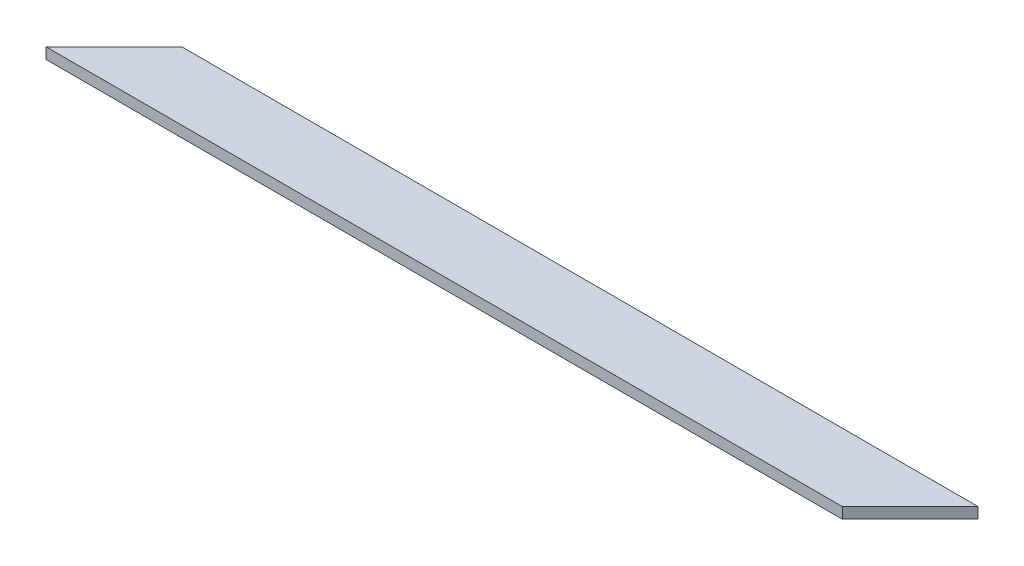
ISO-10303-21;
HEADER;
FILE_DESCRIPTION(('STEP AP214'),'2;1');
FILE_NAME('part.step','',(''),(''),'','','');
FILE_SCHEMA(('AUTOMOTIVE_DESIGN { 1 0 10303 214 1 1 1 1 }'));
ENDSEC;
DATA;
#1=APPLICATION_CONTEXT('core data for automotive mechanical design processes');
#2=APPLICATION_PROTOCOL_DEFINITION('international standard','automotive_design',2000,#1);
#3=PRODUCT_CONTEXT('',#1,'mechanical');
#4=PRODUCT('Part','Part','',(#3));
#5=PRODUCT_RELATED_PRODUCT_CATEGORY('part','',(#4));
#6=PRODUCT_DEFINITION_FORMATION('','',#4);
#7=PRODUCT_DEFINITION_CONTEXT('part definition',#1,'design');
#8=PRODUCT_DEFINITION('design','',#6,#7);
#9=PRODUCT_DEFINITION_SHAPE('','',#8);
#10=(LENGTH_UNIT() NAMED_UNIT(*) SI_UNIT(.MILLI.,.METRE.));
#11=(NAMED_UNIT(*) PLANE_ANGLE_UNIT() SI_UNIT($,.RADIAN.));
#12=(NAMED_UNIT(*) SI_UNIT($,.STERADIAN.) SOLID_ANGLE_UNIT());
#13=UNCERTAINTY_MEASURE_WITH_UNIT(LENGTH_MEASURE(1.E-05),#10,'distance_accuracy_value','');
#14=(GEOMETRIC_REPRESENTATION_CONTEXT(3) GLOBAL_UNCERTAINTY_ASSIGNED_CONTEXT((#13)) GLOBAL_UNIT_ASSIGNED_CONTEXT((#10,
#11,#12)) REPRESENTATION_CONTEXT('',''));
#15=CARTESIAN_POINT('',(0.,0.,0.));
#16=DIRECTION('',(0.,0.,1.));
#17=DIRECTION('',(1.,0.,0.));
#18=AXIS2_PLACEMENT_3D('',#15,#16,#17);
#19=CARTESIAN_POINT('',(-6750.84375,21.59,-2176.4625));
#20=DIRECTION('',(-0.707106781186548,0.,-0.707106781186548));
#21=DIRECTION('',(-0.707106781186548,0.,0.707106781186548));
#22=AXIS2_PLACEMENT_3D('',#19,#20,#21);
#23=PLANE('',#22);
#24=DIRECTION('',(0.707106781186548,0.,-0.707106781186548));
#25=VECTOR('',#24,1.);
#26=CARTESIAN_POINT('',(-6750.84375,0.,-2176.4625));
#27=LINE('',#26,#25);
#28=CARTESIAN_POINT('',(-6750.84375,0.,-2176.4625));
#29=VERTEX_POINT('',#28);
#30=CARTESIAN_POINT('',(-6617.49375,0.,-2309.8125));
#31=VERTEX_POINT('',#30);
#32=EDGE_CURVE('E100',#29,#31,#27,.T.);
#33=ORIENTED_EDGE('',*,*,#32,.F.);
#34=DIRECTION('',(0.,-1.,0.));
#35=VECTOR('',#34,1.);
#36=CARTESIAN_POINT('',(-6750.84375,21.59,-2176.4625));
#37=LINE('',#36,#35);
#38=CARTESIAN_POINT('',(-6750.84375,21.59,-2176.4625));
#39=VERTEX_POINT('',#38);
#40=EDGE_CURVE('E11',#39,#29,#37,.T.);
#41=ORIENTED_EDGE('',*,*,#40,.F.);
#42=DIRECTION('',(0.707106781186548,0.,-0.707106781186548));
#43=VECTOR('',#42,1.);
#44=CARTESIAN_POINT('',(-6750.84375,21.59,-2176.4625));
#45=LINE('',#44,#43);
#46=CARTESIAN_POINT('',(-6617.49375,21.59,-2309.8125));
#47=VERTEX_POINT('',#46);
#48=EDGE_CURVE('E94',#39,#47,#45,.T.);
#49=ORIENTED_EDGE('',*,*,#48,.T.);
#50=DIRECTION('',(0.,-1.,0.));
#51=VECTOR('',#50,1.);
#52=CARTESIAN_POINT('',(-6617.49375,21.59,-2309.8125));
#53=LINE('',#52,#51);
#54=EDGE_CURVE('E38',#47,#31,#53,.T.);
#55=ORIENTED_EDGE('',*,*,#54,.T.);
#56=EDGE_LOOP('',(#33,#41,#49,#55));
#57=FACE_BOUND('',#56,.T.);
#58=ADVANCED_FACE('F35',(#57),#23,.T.);
#59=CARTESIAN_POINT('',(-6750.84375,21.59,-2176.4625));
#60=DIRECTION('',(0.,0.,-1.));
#61=DIRECTION('',(-1.,0.,0.));
#62=AXIS2_PLACEMENT_3D('',#59,#60,#61);
#63=PLANE('',#62);
#64=DIRECTION('',(1.,0.,0.));
#65=VECTOR('',#64,1.);
#66=CARTESIAN_POINT('',(-6750.84375,0.,-2176.4625));
#67=LINE('',#66,#65);
#68=CARTESIAN_POINT('',(-5186.20375,0.,-2176.4625));
#69=VERTEX_POINT('',#68);
#70=EDGE_CURVE('E96',#29,#69,#67,.T.);
#71=ORIENTED_EDGE('',*,*,#70,.T.);
#72=DIRECTION('',(0.,-1.,0.));
#73=VECTOR('',#72,1.);
#74=CARTESIAN_POINT('',(-5186.20375,21.59,-2176.4625));
#75=LINE('',#74,#73);
#76=CARTESIAN_POINT('',(-5186.20375,21.59,-2176.4625));
#77=VERTEX_POINT('',#76);
#78=EDGE_CURVE('E44',#77,#69,#75,.T.);
#79=ORIENTED_EDGE('',*,*,#78,.F.);
#80=DIRECTION('',(1.,0.,0.));
#81=VECTOR('',#80,1.);
#82=CARTESIAN_POINT('',(-6750.84375,21.59,-2176.4625));
#83=LINE('',#82,#81);
#84=EDGE_CURVE('E91',#39,#77,#83,.T.);
#85=ORIENTED_EDGE('',*,*,#84,.F.);
#86=ORIENTED_EDGE('',*,*,#40,.T.);
#87=EDGE_LOOP('',(#71,#79,#85,#86));
#88=FACE_BOUND('',#87,.T.);
#89=ADVANCED_FACE('F107',(#88),#63,.F.);
#90=CARTESIAN_POINT('',(-5052.85375,21.59,-2309.8125));
#91=DIRECTION('',(0.707106781186548,0.,0.707106781186548));
#92=DIRECTION('',(0.707106781186548,0.,-0.707106781186548));
#93=AXIS2_PLACEMENT_3D('',#90,#91,#92);
#94=PLANE('',#93);
#95=DIRECTION('',(-0.707106781186548,0.,0.707106781186548));
#96=VECTOR('',#95,1.);
#97=CARTESIAN_POINT('',(-5052.85375,0.,-2309.8125));
#98=LINE('',#97,#96);
#99=CARTESIAN_POINT('',(-5052.85375,0.,-2309.8125));
#100=VERTEX_POINT('',#99);
#101=EDGE_CURVE('E85',#100,#69,#98,.T.);
#102=ORIENTED_EDGE('',*,*,#101,.F.);
#103=DIRECTION('',(0.,-1.,0.));
#104=VECTOR('',#103,1.);
#105=CARTESIAN_POINT('',(-5052.85375,21.59,-2309.8125));
#106=LINE('',#105,#104);
#107=CARTESIAN_POINT('',(-5052.85375,21.59,-2309.8125));
#108=VERTEX_POINT('',#107);
#109=EDGE_CURVE('E80',#108,#100,#106,.T.);
#110=ORIENTED_EDGE('',*,*,#109,.F.);
#111=DIRECTION('',(-0.707106781186548,0.,0.707106781186548));
#112=VECTOR('',#111,1.);
#113=CARTESIAN_POINT('',(-5052.85375,21.59,-2309.8125));
#114=LINE('',#113,#112);
#115=EDGE_CURVE('E83',#108,#77,#114,.T.);
#116=ORIENTED_EDGE('',*,*,#115,.T.);
#117=ORIENTED_EDGE('',*,*,#78,.T.);
#118=EDGE_LOOP('',(#102,#110,#116,#117));
#119=FACE_BOUND('',#118,.T.);
#120=ADVANCED_FACE('F82',(#119),#94,.T.);
#121=CARTESIAN_POINT('',(-6617.49375,21.59,-2309.8125));
#122=DIRECTION('',(0.,0.,-1.));
#123=DIRECTION('',(-1.,0.,0.));
#124=AXIS2_PLACEMENT_3D('',#121,#122,#123);
#125=PLANE('',#124);
#126=DIRECTION('',(1.,0.,0.));
#127=VECTOR('',#126,1.);
#128=CARTESIAN_POINT('',(-6617.49375,0.,-2309.8125));
#129=LINE('',#128,#127);
#130=EDGE_CURVE('E103',#31,#100,#129,.T.);
#131=ORIENTED_EDGE('',*,*,#130,.F.);
#132=ORIENTED_EDGE('',*,*,#54,.F.);
#133=DIRECTION('',(1.,0.,0.));
#134=VECTOR('',#133,1.);
#135=CARTESIAN_POINT('',(-6617.49375,21.59,-2309.8125));
#136=LINE('',#135,#134);
#137=EDGE_CURVE('E90',#47,#108,#136,.T.);
#138=ORIENTED_EDGE('',*,*,#137,.T.);
#139=ORIENTED_EDGE('',*,*,#109,.T.);
#140=EDGE_LOOP('',(#131,#132,#138,#139));
#141=FACE_BOUND('',#140,.T.);
#142=ADVANCED_FACE('F93',(#141),#125,.T.);
#143=CARTESIAN_POINT('',(0.,21.59,0.));
#144=DIRECTION('',(0.,-1.,0.));
#145=DIRECTION('',(0.,0.,-1.));
#146=AXIS2_PLACEMENT_3D('',#143,#144,#145);
#147=PLANE('',#146);
#148=ORIENTED_EDGE('',*,*,#48,.F.);
#149=ORIENTED_EDGE('',*,*,#84,.T.);
#150=ORIENTED_EDGE('',*,*,#115,.F.);
#151=ORIENTED_EDGE('',*,*,#137,.F.);
#152=EDGE_LOOP('',(#148,#149,#150,#151));
#153=FACE_BOUND('',#152,.T.);
#154=ADVANCED_FACE('F89',(#153),#147,.F.);
#155=CARTESIAN_POINT('',(0.,0.,0.));
#156=DIRECTION('',(0.,-1.,0.));
#157=DIRECTION('',(0.,0.,-1.));
#158=AXIS2_PLACEMENT_3D('',#155,#156,#157);
#159=PLANE('',#158);
#160=ORIENTED_EDGE('',*,*,#32,.T.);
#161=ORIENTED_EDGE('',*,*,#130,.T.);
#162=ORIENTED_EDGE('',*,*,#101,.T.);
#163=ORIENTED_EDGE('',*,*,#70,.F.);
#164=EDGE_LOOP('',(#160,#161,#162,#163));
#165=FACE_BOUND('',#164,.T.);
#166=ADVANCED_FACE('F109',(#165),#159,.T.);
#167=CLOSED_SHELL('',(#58,#89,#120,#142,#154,#166));
#168=MANIFOLD_SOLID_BREP('B2',#167);
#169=ADVANCED_BREP_SHAPE_REPRESENTATION('',(#18,#168),#14);
#170=SHAPE_DEFINITION_REPRESENTATION(#9,#169);
ENDSEC;
END-ISO-10303-21;
